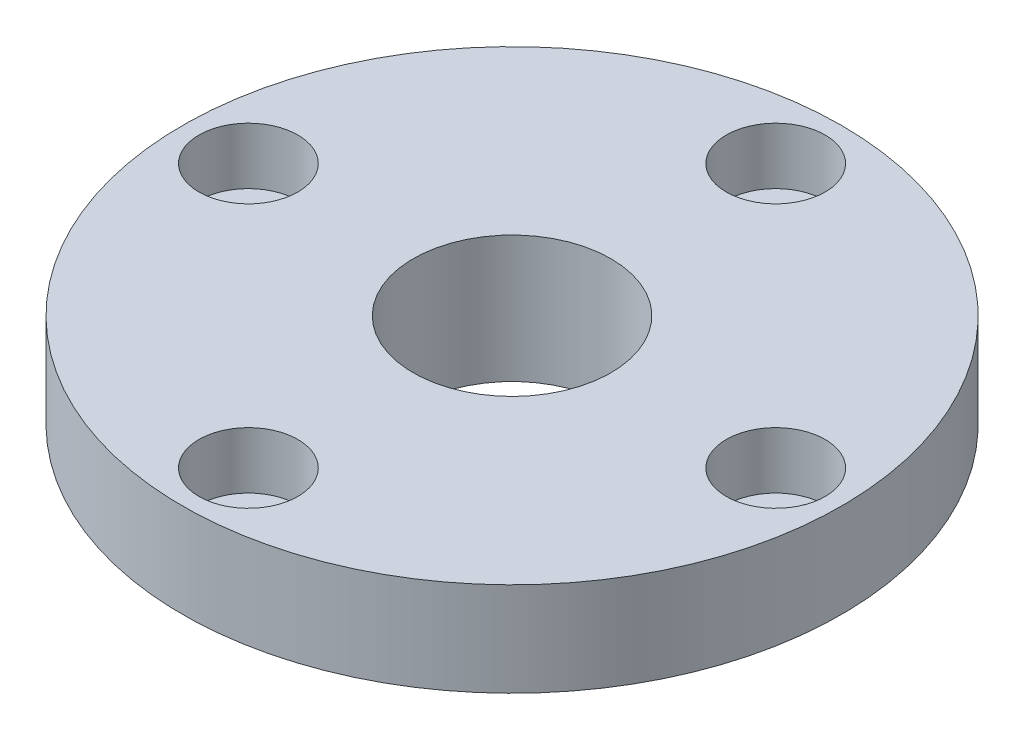
ISO-10303-21;
HEADER;
FILE_DESCRIPTION(('STEP AP214'),'2;1');
FILE_NAME('part.step','',(''),(''),'','','');
FILE_SCHEMA(('AUTOMOTIVE_DESIGN { 1 0 10303 214 1 1 1 1 }'));
ENDSEC;
DATA;
#1=APPLICATION_CONTEXT('core data for automotive mechanical design processes');
#2=APPLICATION_PROTOCOL_DEFINITION('international standard','automotive_design',2000,#1);
#3=PRODUCT_CONTEXT('',#1,'mechanical');
#4=PRODUCT('Part','Part','',(#3));
#5=PRODUCT_RELATED_PRODUCT_CATEGORY('part','',(#4));
#6=PRODUCT_DEFINITION_FORMATION('','',#4);
#7=PRODUCT_DEFINITION_CONTEXT('part definition',#1,'design');
#8=PRODUCT_DEFINITION('design','',#6,#7);
#9=PRODUCT_DEFINITION_SHAPE('','',#8);
#10=(LENGTH_UNIT() NAMED_UNIT(*) SI_UNIT(.MILLI.,.METRE.));
#11=(NAMED_UNIT(*) PLANE_ANGLE_UNIT() SI_UNIT($,.RADIAN.));
#12=(NAMED_UNIT(*) SI_UNIT($,.STERADIAN.) SOLID_ANGLE_UNIT());
#13=UNCERTAINTY_MEASURE_WITH_UNIT(LENGTH_MEASURE(1.E-05),#10,'distance_accuracy_value','');
#14=(GEOMETRIC_REPRESENTATION_CONTEXT(3) GLOBAL_UNCERTAINTY_ASSIGNED_CONTEXT((#13)) GLOBAL_UNIT_ASSIGNED_CONTEXT((#10,
#11,#12)) REPRESENTATION_CONTEXT('',''));
#15=CARTESIAN_POINT('',(0.,0.,0.));
#16=DIRECTION('',(0.,0.,1.));
#17=DIRECTION('',(1.,0.,0.));
#18=AXIS2_PLACEMENT_3D('',#15,#16,#17);
#19=CARTESIAN_POINT('',(-32.5,6.28263277418692,0.));
#20=DIRECTION('',(0.,1.,0.));
#21=DIRECTION('',(0.,0.,1.));
#22=AXIS2_PLACEMENT_3D('',#19,#20,#21);
#23=PLANE('',#22);
#24=CARTESIAN_POINT('',(-40.,6.28263277418692,0.));
#25=DIRECTION('',(0.,1.,0.));
#26=DIRECTION('',(0.,0.,1.));
#27=AXIS2_PLACEMENT_3D('',#24,#25,#26);
#28=CIRCLE('',#27,4.49999999999999);
#29=CARTESIAN_POINT('',(-40.,6.28263277418692,4.49999999999999));
#30=VERTEX_POINT('',#29);
#31=EDGE_CURVE('E34',#30,#30,#28,.T.);
#32=ORIENTED_EDGE('',*,*,#31,.T.);
#33=EDGE_LOOP('',(#32));
#34=FACE_BOUND('',#33,.T.);
#35=CARTESIAN_POINT('',(0.,6.28263277418692,-40.));
#36=DIRECTION('',(0.,1.,0.));
#37=DIRECTION('',(0.,0.,1.));
#38=AXIS2_PLACEMENT_3D('',#35,#36,#37);
#39=CIRCLE('',#38,4.49999999999999);
#40=CARTESIAN_POINT('',(0.,6.28263277418692,-35.5));
#41=VERTEX_POINT('',#40);
#42=EDGE_CURVE('E56',#41,#41,#39,.T.);
#43=ORIENTED_EDGE('',*,*,#42,.T.);
#44=EDGE_LOOP('',(#43));
#45=FACE_BOUND('',#44,.T.);
#46=CARTESIAN_POINT('',(40.,6.28263277418692,0.));
#47=DIRECTION('',(0.,1.,0.));
#48=DIRECTION('',(0.,0.,1.));
#49=AXIS2_PLACEMENT_3D('',#46,#47,#48);
#50=CIRCLE('',#49,4.49999999999999);
#51=CARTESIAN_POINT('',(40.,6.28263277418692,4.49999999999999));
#52=VERTEX_POINT('',#51);
#53=EDGE_CURVE('E52',#52,#52,#50,.T.);
#54=ORIENTED_EDGE('',*,*,#53,.T.);
#55=EDGE_LOOP('',(#54));
#56=FACE_BOUND('',#55,.T.);
#57=CARTESIAN_POINT('',(0.,6.28263277418692,40.));
#58=DIRECTION('',(0.,1.,0.));
#59=DIRECTION('',(0.,0.,1.));
#60=AXIS2_PLACEMENT_3D('',#57,#58,#59);
#61=CIRCLE('',#60,4.49999999999999);
#62=CARTESIAN_POINT('',(0.,6.28263277418692,44.5));
#63=VERTEX_POINT('',#62);
#64=EDGE_CURVE('E47',#63,#63,#61,.T.);
#65=ORIENTED_EDGE('',*,*,#64,.T.);
#66=EDGE_LOOP('',(#65));
#67=FACE_BOUND('',#66,.T.);
#68=CARTESIAN_POINT('',(0.,6.28263277418692,0.));
#69=DIRECTION('',(0.,-1.,0.));
#70=DIRECTION('',(0.,0.,-1.));
#71=AXIS2_PLACEMENT_3D('',#68,#69,#70);
#72=CIRCLE('',#71,32.5);
#73=CARTESIAN_POINT('',(0.,6.28263277418692,-32.5));
#74=VERTEX_POINT('',#73);
#75=EDGE_CURVE('E10',#74,#74,#72,.T.);
#76=ORIENTED_EDGE('',*,*,#75,.F.);
#77=EDGE_LOOP('',(#76));
#78=FACE_BOUND('',#77,.T.);
#79=CARTESIAN_POINT('',(0.,6.28263277418692,0.));
#80=DIRECTION('',(0.,-1.,0.));
#81=DIRECTION('',(0.,0.,-1.));
#82=AXIS2_PLACEMENT_3D('',#79,#80,#81);
#83=CIRCLE('',#82,50.);
#84=CARTESIAN_POINT('',(0.,6.28263277418692,-50.));
#85=VERTEX_POINT('',#84);
#86=EDGE_CURVE('E50',#85,#85,#83,.T.);
#87=ORIENTED_EDGE('',*,*,#86,.T.);
#88=EDGE_LOOP('',(#87));
#89=FACE_BOUND('',#88,.T.);
#90=ADVANCED_FACE('F31',(#34,#45,#56,#67,#78,#89),#23,.F.);
#91=CARTESIAN_POINT('',(0.,0.,0.));
#92=DIRECTION('',(0.,-1.,0.));
#93=DIRECTION('',(0.,0.,-1.));
#94=AXIS2_PLACEMENT_3D('',#91,#92,#93);
#95=CYLINDRICAL_SURFACE('',#94,32.5);
#96=CARTESIAN_POINT('',(0.,1.28263277418692,0.));
#97=DIRECTION('',(0.,-1.,0.));
#98=DIRECTION('',(0.,0.,-1.));
#99=AXIS2_PLACEMENT_3D('',#96,#97,#98);
#100=CIRCLE('',#99,32.5);
#101=CARTESIAN_POINT('',(0.,1.28263277418692,-32.5));
#102=VERTEX_POINT('',#101);
#103=EDGE_CURVE('E38',#102,#102,#100,.T.);
#104=ORIENTED_EDGE('',*,*,#103,.F.);
#105=EDGE_LOOP('',(#104));
#106=FACE_BOUND('',#105,.T.);
#107=ORIENTED_EDGE('',*,*,#75,.T.);
#108=EDGE_LOOP('',(#107));
#109=FACE_BOUND('',#108,.T.);
#110=ADVANCED_FACE('F101',(#106,#109),#95,.T.);
#111=CARTESIAN_POINT('',(-15.,1.28263277418692,0.));
#112=DIRECTION('',(0.,1.,0.));
#113=DIRECTION('',(0.,0.,1.));
#114=AXIS2_PLACEMENT_3D('',#111,#112,#113);
#115=PLANE('',#114);
#116=CARTESIAN_POINT('',(0.,1.28263277418692,0.));
#117=DIRECTION('',(0.,-1.,0.));
#118=DIRECTION('',(0.,0.,-1.));
#119=AXIS2_PLACEMENT_3D('',#116,#117,#118);
#120=CIRCLE('',#119,15.);
#121=CARTESIAN_POINT('',(0.,1.28263277418692,-15.));
#122=VERTEX_POINT('',#121);
#123=EDGE_CURVE('E43',#122,#122,#120,.T.);
#124=ORIENTED_EDGE('',*,*,#123,.F.);
#125=EDGE_LOOP('',(#124));
#126=FACE_BOUND('',#125,.T.);
#127=ORIENTED_EDGE('',*,*,#103,.T.);
#128=EDGE_LOOP('',(#127));
#129=FACE_BOUND('',#128,.T.);
#130=ADVANCED_FACE('F98',(#126,#129),#115,.F.);
#131=CARTESIAN_POINT('',(0.,0.,0.));
#132=DIRECTION('',(0.,-1.,0.));
#133=DIRECTION('',(0.,0.,-1.));
#134=AXIS2_PLACEMENT_3D('',#131,#132,#133);
#135=CYLINDRICAL_SURFACE('',#134,15.);
#136=CARTESIAN_POINT('',(0.,20.5326327741869,0.));
#137=DIRECTION('',(0.,-1.,0.));
#138=DIRECTION('',(0.,0.,-1.));
#139=AXIS2_PLACEMENT_3D('',#136,#137,#138);
#140=CIRCLE('',#139,15.);
#141=CARTESIAN_POINT('',(0.,20.5326327741869,-15.));
#142=VERTEX_POINT('',#141);
#143=EDGE_CURVE('E91',#142,#142,#140,.T.);
#144=ORIENTED_EDGE('',*,*,#143,.F.);
#145=EDGE_LOOP('',(#144));
#146=FACE_BOUND('',#145,.T.);
#147=ORIENTED_EDGE('',*,*,#123,.T.);
#148=EDGE_LOOP('',(#147));
#149=FACE_BOUND('',#148,.T.);
#150=ADVANCED_FACE('F96',(#146,#149),#135,.F.);
#151=CARTESIAN_POINT('',(-15.,20.5326327741869,0.));
#152=DIRECTION('',(0.,-1.,0.));
#153=DIRECTION('',(0.,0.,-1.));
#154=AXIS2_PLACEMENT_3D('',#151,#152,#153);
#155=PLANE('',#154);
#156=CARTESIAN_POINT('',(-40.,20.5326327741869,0.));
#157=DIRECTION('',(0.,1.,0.));
#158=DIRECTION('',(0.,0.,1.));
#159=AXIS2_PLACEMENT_3D('',#156,#157,#158);
#160=CIRCLE('',#159,7.5);
#161=CARTESIAN_POINT('',(-40.,20.5326327741869,7.5));
#162=VERTEX_POINT('',#161);
#163=EDGE_CURVE('E176',#162,#162,#160,.T.);
#164=ORIENTED_EDGE('',*,*,#163,.F.);
#165=EDGE_LOOP('',(#164));
#166=FACE_BOUND('',#165,.T.);
#167=CARTESIAN_POINT('',(0.,20.5326327741869,-40.));
#168=DIRECTION('',(0.,1.,0.));
#169=DIRECTION('',(0.,0.,1.));
#170=AXIS2_PLACEMENT_3D('',#167,#168,#169);
#171=CIRCLE('',#170,7.5);
#172=CARTESIAN_POINT('',(0.,20.5326327741869,-32.5));
#173=VERTEX_POINT('',#172);
#174=EDGE_CURVE('E71',#173,#173,#171,.T.);
#175=ORIENTED_EDGE('',*,*,#174,.F.);
#176=EDGE_LOOP('',(#175));
#177=FACE_BOUND('',#176,.T.);
#178=CARTESIAN_POINT('',(40.,20.5326327741869,0.));
#179=DIRECTION('',(0.,1.,0.));
#180=DIRECTION('',(0.,0.,1.));
#181=AXIS2_PLACEMENT_3D('',#178,#179,#180);
#182=CIRCLE('',#181,7.5);
#183=CARTESIAN_POINT('',(40.,20.5326327741869,7.5));
#184=VERTEX_POINT('',#183);
#185=EDGE_CURVE('E58',#184,#184,#182,.T.);
#186=ORIENTED_EDGE('',*,*,#185,.F.);
#187=EDGE_LOOP('',(#186));
#188=FACE_BOUND('',#187,.T.);
#189=CARTESIAN_POINT('',(0.,20.5326327741869,40.));
#190=DIRECTION('',(0.,1.,0.));
#191=DIRECTION('',(0.,0.,1.));
#192=AXIS2_PLACEMENT_3D('',#189,#190,#191);
#193=CIRCLE('',#192,7.5);
#194=CARTESIAN_POINT('',(0.,20.5326327741869,47.5));
#195=VERTEX_POINT('',#194);
#196=EDGE_CURVE('E54',#195,#195,#193,.T.);
#197=ORIENTED_EDGE('',*,*,#196,.F.);
#198=EDGE_LOOP('',(#197));
#199=FACE_BOUND('',#198,.T.);
#200=CARTESIAN_POINT('',(0.,20.5326327741869,0.));
#201=DIRECTION('',(0.,-1.,0.));
#202=DIRECTION('',(0.,0.,-1.));
#203=AXIS2_PLACEMENT_3D('',#200,#201,#202);
#204=CIRCLE('',#203,50.);
#205=CARTESIAN_POINT('',(0.,20.5326327741869,-50.));
#206=VERTEX_POINT('',#205);
#207=EDGE_CURVE('E88',#206,#206,#204,.T.);
#208=ORIENTED_EDGE('',*,*,#207,.F.);
#209=EDGE_LOOP('',(#208));
#210=FACE_BOUND('',#209,.T.);
#211=ORIENTED_EDGE('',*,*,#143,.T.);
#212=EDGE_LOOP('',(#211));
#213=FACE_BOUND('',#212,.T.);
#214=ADVANCED_FACE('F113',(#166,#177,#188,#199,#210,#213),#155,.F.);
#215=CARTESIAN_POINT('',(0.,0.,0.));
#216=DIRECTION('',(0.,-1.,0.));
#217=DIRECTION('',(0.,0.,-1.));
#218=AXIS2_PLACEMENT_3D('',#215,#216,#217);
#219=CYLINDRICAL_SURFACE('',#218,50.);
#220=ORIENTED_EDGE('',*,*,#86,.F.);
#221=EDGE_LOOP('',(#220));
#222=FACE_BOUND('',#221,.T.);
#223=ORIENTED_EDGE('',*,*,#207,.T.);
#224=EDGE_LOOP('',(#223));
#225=FACE_BOUND('',#224,.T.);
#226=ADVANCED_FACE('F117',(#222,#225),#219,.T.);
#227=CARTESIAN_POINT('',(0.,20.5326327741869,40.));
#228=DIRECTION('',(0.,1.,0.));
#229=DIRECTION('',(0.,0.,1.));
#230=AXIS2_PLACEMENT_3D('',#227,#228,#229);
#231=CYLINDRICAL_SURFACE('',#230,4.49999999999999);
#232=CARTESIAN_POINT('',(0.,11.9326327741869,40.));
#233=DIRECTION('',(0.,1.,0.));
#234=DIRECTION('',(0.,0.,1.));
#235=AXIS2_PLACEMENT_3D('',#232,#233,#234);
#236=CIRCLE('',#235,4.49999999999999);
#237=CARTESIAN_POINT('',(0.,11.9326327741869,44.5));
#238=VERTEX_POINT('',#237);
#239=EDGE_CURVE('E51',#238,#238,#236,.T.);
#240=ORIENTED_EDGE('',*,*,#239,.T.);
#241=EDGE_LOOP('',(#240));
#242=FACE_BOUND('',#241,.T.);
#243=ORIENTED_EDGE('',*,*,#64,.F.);
#244=EDGE_LOOP('',(#243));
#245=FACE_BOUND('',#244,.T.);
#246=ADVANCED_FACE('F121',(#242,#245),#231,.F.);
#247=CARTESIAN_POINT('',(4.49999999999999,11.9326327741869,40.));
#248=DIRECTION('',(0.,-1.,0.));
#249=DIRECTION('',(0.,0.,-1.));
#250=AXIS2_PLACEMENT_3D('',#247,#248,#249);
#251=PLANE('',#250);
#252=ORIENTED_EDGE('',*,*,#239,.F.);
#253=EDGE_LOOP('',(#252));
#254=FACE_BOUND('',#253,.T.);
#255=CARTESIAN_POINT('',(0.,11.9326327741869,40.));
#256=DIRECTION('',(0.,1.,0.));
#257=DIRECTION('',(0.,0.,1.));
#258=AXIS2_PLACEMENT_3D('',#255,#256,#257);
#259=CIRCLE('',#258,7.5);
#260=CARTESIAN_POINT('',(0.,11.9326327741869,47.5));
#261=VERTEX_POINT('',#260);
#262=EDGE_CURVE('E81',#261,#261,#259,.T.);
#263=ORIENTED_EDGE('',*,*,#262,.T.);
#264=EDGE_LOOP('',(#263));
#265=FACE_BOUND('',#264,.T.);
#266=ADVANCED_FACE('F125',(#254,#265),#251,.F.);
#267=CARTESIAN_POINT('',(0.,20.5326327741869,40.));
#268=DIRECTION('',(0.,1.,0.));
#269=DIRECTION('',(0.,0.,1.));
#270=AXIS2_PLACEMENT_3D('',#267,#268,#269);
#271=CYLINDRICAL_SURFACE('',#270,7.5);
#272=ORIENTED_EDGE('',*,*,#262,.F.);
#273=EDGE_LOOP('',(#272));
#274=FACE_BOUND('',#273,.T.);
#275=ORIENTED_EDGE('',*,*,#196,.T.);
#276=EDGE_LOOP('',(#275));
#277=FACE_BOUND('',#276,.T.);
#278=ADVANCED_FACE('F129',(#274,#277),#271,.F.);
#279=CARTESIAN_POINT('',(40.,20.5326327741869,0.));
#280=DIRECTION('',(0.,1.,0.));
#281=DIRECTION('',(0.,0.,1.));
#282=AXIS2_PLACEMENT_3D('',#279,#280,#281);
#283=CYLINDRICAL_SURFACE('',#282,4.49999999999999);
#284=CARTESIAN_POINT('',(40.,11.9326327741869,0.));
#285=DIRECTION('',(0.,1.,0.));
#286=DIRECTION('',(0.,0.,1.));
#287=AXIS2_PLACEMENT_3D('',#284,#285,#286);
#288=CIRCLE('',#287,4.5);
#289=CARTESIAN_POINT('',(40.,11.9326327741869,4.5));
#290=VERTEX_POINT('',#289);
#291=EDGE_CURVE('E55',#290,#290,#288,.T.);
#292=ORIENTED_EDGE('',*,*,#291,.T.);
#293=EDGE_LOOP('',(#292));
#294=FACE_BOUND('',#293,.T.);
#295=ORIENTED_EDGE('',*,*,#53,.F.);
#296=EDGE_LOOP('',(#295));
#297=FACE_BOUND('',#296,.T.);
#298=ADVANCED_FACE('F133',(#294,#297),#283,.F.);
#299=CARTESIAN_POINT('',(44.5,11.9326327741869,0.));
#300=DIRECTION('',(0.,-1.,0.));
#301=DIRECTION('',(0.,0.,-1.));
#302=AXIS2_PLACEMENT_3D('',#299,#300,#301);
#303=PLANE('',#302);
#304=ORIENTED_EDGE('',*,*,#291,.F.);
#305=EDGE_LOOP('',(#304));
#306=FACE_BOUND('',#305,.T.);
#307=CARTESIAN_POINT('',(40.,11.9326327741869,0.));
#308=DIRECTION('',(0.,1.,0.));
#309=DIRECTION('',(0.,0.,1.));
#310=AXIS2_PLACEMENT_3D('',#307,#308,#309);
#311=CIRCLE('',#310,7.5);
#312=CARTESIAN_POINT('',(40.,11.9326327741869,7.5));
#313=VERTEX_POINT('',#312);
#314=EDGE_CURVE('E63',#313,#313,#311,.T.);
#315=ORIENTED_EDGE('',*,*,#314,.T.);
#316=EDGE_LOOP('',(#315));
#317=FACE_BOUND('',#316,.T.);
#318=ADVANCED_FACE('F137',(#306,#317),#303,.F.);
#319=CARTESIAN_POINT('',(40.,20.5326327741869,0.));
#320=DIRECTION('',(0.,1.,0.));
#321=DIRECTION('',(0.,0.,1.));
#322=AXIS2_PLACEMENT_3D('',#319,#320,#321);
#323=CYLINDRICAL_SURFACE('',#322,7.5);
#324=ORIENTED_EDGE('',*,*,#314,.F.);
#325=EDGE_LOOP('',(#324));
#326=FACE_BOUND('',#325,.T.);
#327=ORIENTED_EDGE('',*,*,#185,.T.);
#328=EDGE_LOOP('',(#327));
#329=FACE_BOUND('',#328,.T.);
#330=ADVANCED_FACE('F141',(#326,#329),#323,.F.);
#331=CARTESIAN_POINT('',(0.,20.5326327741869,-40.));
#332=DIRECTION('',(0.,1.,0.));
#333=DIRECTION('',(0.,0.,1.));
#334=AXIS2_PLACEMENT_3D('',#331,#332,#333);
#335=CYLINDRICAL_SURFACE('',#334,4.49999999999999);
#336=CARTESIAN_POINT('',(0.,11.9326327741869,-40.));
#337=DIRECTION('',(0.,1.,0.));
#338=DIRECTION('',(0.,0.,1.));
#339=AXIS2_PLACEMENT_3D('',#336,#337,#338);
#340=CIRCLE('',#339,4.49999999999999);
#341=CARTESIAN_POINT('',(0.,11.9326327741869,-35.5));
#342=VERTEX_POINT('',#341);
#343=EDGE_CURVE('E59',#342,#342,#340,.T.);
#344=ORIENTED_EDGE('',*,*,#343,.T.);
#345=EDGE_LOOP('',(#344));
#346=FACE_BOUND('',#345,.T.);
#347=ORIENTED_EDGE('',*,*,#42,.F.);
#348=EDGE_LOOP('',(#347));
#349=FACE_BOUND('',#348,.T.);
#350=ADVANCED_FACE('F145',(#346,#349),#335,.F.);
#351=CARTESIAN_POINT('',(4.49999999999999,11.9326327741869,-40.));
#352=DIRECTION('',(0.,-1.,0.));
#353=DIRECTION('',(0.,0.,-1.));
#354=AXIS2_PLACEMENT_3D('',#351,#352,#353);
#355=PLANE('',#354);
#356=ORIENTED_EDGE('',*,*,#343,.F.);
#357=EDGE_LOOP('',(#356));
#358=FACE_BOUND('',#357,.T.);
#359=CARTESIAN_POINT('',(0.,11.9326327741869,-40.));
#360=DIRECTION('',(0.,1.,0.));
#361=DIRECTION('',(0.,0.,1.));
#362=AXIS2_PLACEMENT_3D('',#359,#360,#361);
#363=CIRCLE('',#362,7.5);
#364=CARTESIAN_POINT('',(0.,11.9326327741869,-32.5));
#365=VERTEX_POINT('',#364);
#366=EDGE_CURVE('E66',#365,#365,#363,.T.);
#367=ORIENTED_EDGE('',*,*,#366,.T.);
#368=EDGE_LOOP('',(#367));
#369=FACE_BOUND('',#368,.T.);
#370=ADVANCED_FACE('F149',(#358,#369),#355,.F.);
#371=CARTESIAN_POINT('',(0.,20.5326327741869,-40.));
#372=DIRECTION('',(0.,1.,0.));
#373=DIRECTION('',(0.,0.,1.));
#374=AXIS2_PLACEMENT_3D('',#371,#372,#373);
#375=CYLINDRICAL_SURFACE('',#374,7.5);
#376=ORIENTED_EDGE('',*,*,#366,.F.);
#377=EDGE_LOOP('',(#376));
#378=FACE_BOUND('',#377,.T.);
#379=ORIENTED_EDGE('',*,*,#174,.T.);
#380=EDGE_LOOP('',(#379));
#381=FACE_BOUND('',#380,.T.);
#382=ADVANCED_FACE('F152',(#378,#381),#375,.F.);
#383=CARTESIAN_POINT('',(-40.,20.5326327741869,0.));
#384=DIRECTION('',(0.,1.,0.));
#385=DIRECTION('',(0.,0.,1.));
#386=AXIS2_PLACEMENT_3D('',#383,#384,#385);
#387=CYLINDRICAL_SURFACE('',#386,4.49999999999999);
#388=CARTESIAN_POINT('',(-40.,11.9326327741869,0.));
#389=DIRECTION('',(0.,1.,0.));
#390=DIRECTION('',(0.,0.,1.));
#391=AXIS2_PLACEMENT_3D('',#388,#389,#390);
#392=CIRCLE('',#391,4.5);
#393=CARTESIAN_POINT('',(-40.,11.9326327741869,4.5));
#394=VERTEX_POINT('',#393);
#395=EDGE_CURVE('E178',#394,#394,#392,.T.);
#396=ORIENTED_EDGE('',*,*,#395,.T.);
#397=EDGE_LOOP('',(#396));
#398=FACE_BOUND('',#397,.T.);
#399=ORIENTED_EDGE('',*,*,#31,.F.);
#400=EDGE_LOOP('',(#399));
#401=FACE_BOUND('',#400,.T.);
#402=ADVANCED_FACE('F156',(#398,#401),#387,.F.);
#403=CARTESIAN_POINT('',(-35.5,11.9326327741869,0.));
#404=DIRECTION('',(0.,-1.,0.));
#405=DIRECTION('',(0.,0.,-1.));
#406=AXIS2_PLACEMENT_3D('',#403,#404,#405);
#407=PLANE('',#406);
#408=ORIENTED_EDGE('',*,*,#395,.F.);
#409=EDGE_LOOP('',(#408));
#410=FACE_BOUND('',#409,.T.);
#411=CARTESIAN_POINT('',(-40.,11.9326327741869,0.));
#412=DIRECTION('',(0.,1.,0.));
#413=DIRECTION('',(0.,0.,1.));
#414=AXIS2_PLACEMENT_3D('',#411,#412,#413);
#415=CIRCLE('',#414,7.5);
#416=CARTESIAN_POINT('',(-40.,11.9326327741869,7.5));
#417=VERTEX_POINT('',#416);
#418=EDGE_CURVE('E173',#417,#417,#415,.T.);
#419=ORIENTED_EDGE('',*,*,#418,.T.);
#420=EDGE_LOOP('',(#419));
#421=FACE_BOUND('',#420,.T.);
#422=ADVANCED_FACE('F160',(#410,#421),#407,.F.);
#423=CARTESIAN_POINT('',(-40.,20.5326327741869,0.));
#424=DIRECTION('',(0.,1.,0.));
#425=DIRECTION('',(0.,0.,1.));
#426=AXIS2_PLACEMENT_3D('',#423,#424,#425);
#427=CYLINDRICAL_SURFACE('',#426,7.5);
#428=ORIENTED_EDGE('',*,*,#418,.F.);
#429=EDGE_LOOP('',(#428));
#430=FACE_BOUND('',#429,.T.);
#431=ORIENTED_EDGE('',*,*,#163,.T.);
#432=EDGE_LOOP('',(#431));
#433=FACE_BOUND('',#432,.T.);
#434=ADVANCED_FACE('F164',(#430,#433),#427,.F.);
#435=CLOSED_SHELL('',(#90,#110,#130,#150,#214,#226,#246,#266,#278,#298,#318,#330,#350,#370,#382,
#402,#422,#434));
#436=MANIFOLD_SOLID_BREP('B2',#435);
#437=ADVANCED_BREP_SHAPE_REPRESENTATION('',(#18,#436),#14);
#438=SHAPE_DEFINITION_REPRESENTATION(#9,#437);
ENDSEC;
END-ISO-10303-21;
